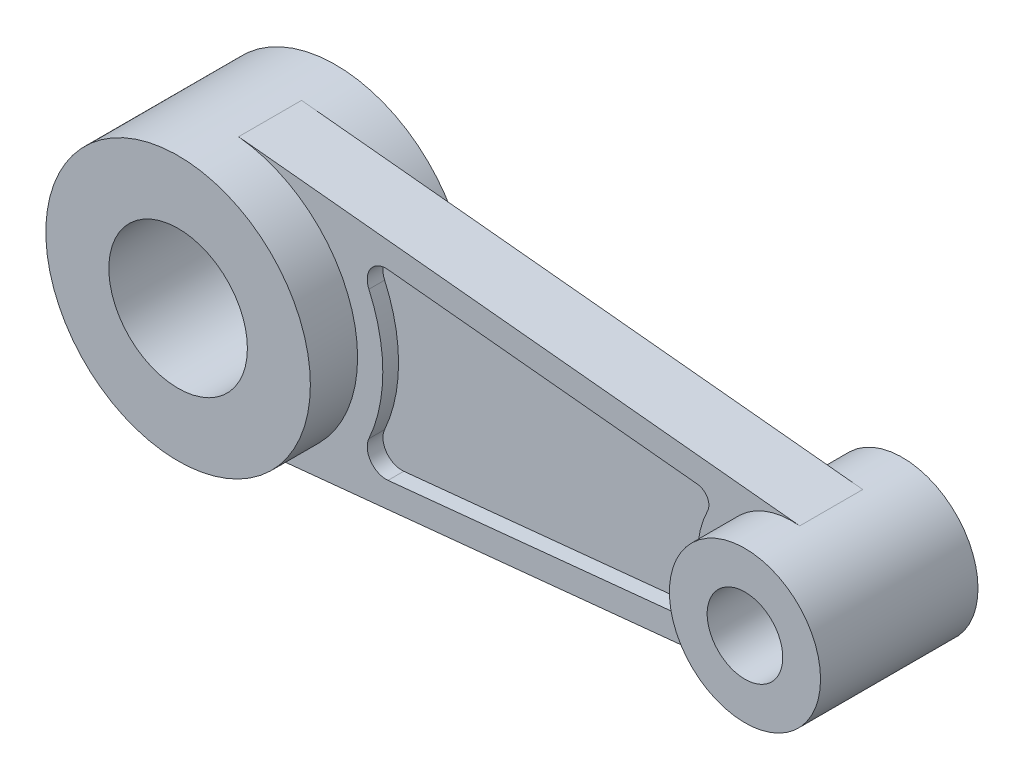
ISO-10303-21;
HEADER;
FILE_DESCRIPTION(('STEP AP214'),'2;1');
FILE_NAME('part.step','',(''),(''),'','','');
FILE_SCHEMA(('AUTOMOTIVE_DESIGN { 1 0 10303 214 1 1 1 1 }'));
ENDSEC;
DATA;
#1=APPLICATION_CONTEXT('core data for automotive mechanical design processes');
#2=APPLICATION_PROTOCOL_DEFINITION('international standard','automotive_design',2000,#1);
#3=PRODUCT_CONTEXT('',#1,'mechanical');
#4=PRODUCT('Part','Part','',(#3));
#5=PRODUCT_RELATED_PRODUCT_CATEGORY('part','',(#4));
#6=PRODUCT_DEFINITION_FORMATION('','',#4);
#7=PRODUCT_DEFINITION_CONTEXT('part definition',#1,'design');
#8=PRODUCT_DEFINITION('design','',#6,#7);
#9=PRODUCT_DEFINITION_SHAPE('','',#8);
#10=(LENGTH_UNIT() NAMED_UNIT(*) SI_UNIT(.MILLI.,.METRE.));
#11=(NAMED_UNIT(*) PLANE_ANGLE_UNIT() SI_UNIT($,.RADIAN.));
#12=(NAMED_UNIT(*) SI_UNIT($,.STERADIAN.) SOLID_ANGLE_UNIT());
#13=UNCERTAINTY_MEASURE_WITH_UNIT(LENGTH_MEASURE(1.E-05),#10,'distance_accuracy_value','');
#14=(GEOMETRIC_REPRESENTATION_CONTEXT(3) GLOBAL_UNCERTAINTY_ASSIGNED_CONTEXT((#13)) GLOBAL_UNIT_ASSIGNED_CONTEXT((#10,
#11,#12)) REPRESENTATION_CONTEXT('',''));
#15=CARTESIAN_POINT('',(0.,0.,0.));
#16=DIRECTION('',(0.,0.,1.));
#17=DIRECTION('',(1.,0.,0.));
#18=AXIS2_PLACEMENT_3D('',#15,#16,#17);
#19=CARTESIAN_POINT('',(0.,0.,-127.));
#20=DIRECTION('',(0.,0.,1.));
#21=DIRECTION('',(1.,0.,0.));
#22=AXIS2_PLACEMENT_3D('',#19,#20,#21);
#23=PLANE('',#22);
#24=CARTESIAN_POINT('',(0.,0.,-127.));
#25=DIRECTION('',(0.,0.,-1.));
#26=DIRECTION('',(1.,0.,0.));
#27=AXIS2_PLACEMENT_3D('',#24,#25,#26);
#28=CIRCLE('',#27,533.4);
#29=CARTESIAN_POINT('',(53.34,530.726298952671,-127.));
#30=VERTEX_POINT('',#29);
#31=CARTESIAN_POINT('',(53.34,-530.726298952671,-127.));
#32=VERTEX_POINT('',#31);
#33=EDGE_CURVE('E389',#30,#32,#28,.T.);
#34=ORIENTED_EDGE('',*,*,#33,.F.);
#35=DIRECTION('',(-0.99498743710662,0.1,0.));
#36=VECTOR('',#35,1.);
#37=CARTESIAN_POINT('',(53.34,530.726298952671,-127.));
#38=LINE('',#37,#36);
#39=CARTESIAN_POINT('',(2316.48,303.272170830098,-127.));
#40=VERTEX_POINT('',#39);
#41=EDGE_CURVE('E398',#40,#30,#38,.T.);
#42=ORIENTED_EDGE('',*,*,#41,.F.);
#43=CARTESIAN_POINT('',(2286.,0.,-127.));
#44=DIRECTION('',(0.,0.,-1.));
#45=DIRECTION('',(1.,0.,0.));
#46=AXIS2_PLACEMENT_3D('',#43,#44,#45);
#47=CIRCLE('',#46,304.8);
#48=CARTESIAN_POINT('',(2316.48,-303.272170830098,-127.));
#49=VERTEX_POINT('',#48);
#50=EDGE_CURVE('E414',#49,#40,#47,.T.);
#51=ORIENTED_EDGE('',*,*,#50,.F.);
#52=DIRECTION('',(0.99498743710662,0.1,0.));
#53=VECTOR('',#52,1.);
#54=CARTESIAN_POINT('',(53.34,-530.726298952671,-127.));
#55=LINE('',#54,#53);
#56=EDGE_CURVE('E411',#32,#49,#55,.T.);
#57=ORIENTED_EDGE('',*,*,#56,.F.);
#58=EDGE_LOOP('',(#34,#42,#51,#57));
#59=FACE_BOUND('',#58,.T.);
#60=CARTESIAN_POINT('',(2286.,0.,-127.));
#61=DIRECTION('',(0.,0.,1.));
#62=DIRECTION('',(-1.,0.,0.));
#63=AXIS2_PLACEMENT_3D('',#60,#61,#62);
#64=CIRCLE('',#63,381.);
#65=CARTESIAN_POINT('',(1944.75300151405,169.444639998829,-127.));
#66=VERTEX_POINT('',#65);
#67=CARTESIAN_POINT('',(1944.75300151405,-169.444639998829,-127.));
#68=VERTEX_POINT('',#67);
#69=EDGE_CURVE('E232',#66,#68,#64,.T.);
#70=ORIENTED_EDGE('',*,*,#69,.F.);
#71=CARTESIAN_POINT('',(1899.25340171593,192.037258665339,-127.));
#72=DIRECTION('',(0.,0.,-1.));
#73=DIRECTION('',(-1.,0.,0.));
#74=AXIS2_PLACEMENT_3D('',#71,#72,#73);
#75=CIRCLE('',#74,50.8);
#76=CARTESIAN_POINT('',(1904.33340171593,242.582620470356,-127.));
#77=VERTEX_POINT('',#76);
#78=EDGE_CURVE('E59',#77,#66,#75,.T.);
#79=ORIENTED_EDGE('',*,*,#78,.F.);
#80=DIRECTION('',(0.99498743710662,-0.1,0.));
#81=VECTOR('',#80,1.);
#82=CARTESIAN_POINT('',(1904.33340171593,242.582620470356,-127.));
#83=LINE('',#82,#81);
#84=CARTESIAN_POINT('',(656.009943132677,368.043848625489,-127.));
#85=VERTEX_POINT('',#84);
#86=EDGE_CURVE('E204',#85,#77,#83,.T.);
#87=ORIENTED_EDGE('',*,*,#86,.F.);
#88=CARTESIAN_POINT('',(648.389943132677,292.225805917965,-127.));
#89=DIRECTION('',(0.,0.,-1.));
#90=DIRECTION('',(-1.,0.,0.));
#91=AXIS2_PLACEMENT_3D('',#88,#89,#90);
#92=CIRCLE('',#91,76.2000000000001);
#93=CARTESIAN_POINT('',(578.919592082747,260.91589814104,-127.));
#94=VERTEX_POINT('',#93);
#95=EDGE_CURVE('E208',#94,#85,#92,.T.);
#96=ORIENTED_EDGE('',*,*,#95,.F.);
#97=CARTESIAN_POINT('',(0.,0.,-127.));
#98=DIRECTION('',(0.,0.,1.));
#99=DIRECTION('',(-1.,0.,0.));
#100=AXIS2_PLACEMENT_3D('',#97,#98,#99);
#101=CIRCLE('',#100,635.);
#102=CARTESIAN_POINT('',(578.919592082747,-260.91589814104,-127.));
#103=VERTEX_POINT('',#102);
#104=EDGE_CURVE('E247',#103,#94,#101,.T.);
#105=ORIENTED_EDGE('',*,*,#104,.F.);
#106=CARTESIAN_POINT('',(648.389943132677,-292.225805917965,-127.));
#107=DIRECTION('',(0.,0.,-1.));
#108=DIRECTION('',(-1.,0.,0.));
#109=AXIS2_PLACEMENT_3D('',#106,#107,#108);
#110=CIRCLE('',#109,76.2000000000001);
#111=CARTESIAN_POINT('',(656.009943132677,-368.043848625489,-127.));
#112=VERTEX_POINT('',#111);
#113=EDGE_CURVE('E243',#112,#103,#110,.T.);
#114=ORIENTED_EDGE('',*,*,#113,.F.);
#115=DIRECTION('',(-0.99498743710662,-0.1,0.));
#116=VECTOR('',#115,1.);
#117=CARTESIAN_POINT('',(656.009943132677,-368.043848625489,-127.));
#118=LINE('',#117,#116);
#119=CARTESIAN_POINT('',(1904.33340171593,-242.582620470356,-127.));
#120=VERTEX_POINT('',#119);
#121=EDGE_CURVE('E239',#120,#112,#118,.T.);
#122=ORIENTED_EDGE('',*,*,#121,.F.);
#123=CARTESIAN_POINT('',(1899.25340171593,-192.037258665339,-127.));
#124=DIRECTION('',(0.,0.,-1.));
#125=DIRECTION('',(-1.,0.,0.));
#126=AXIS2_PLACEMENT_3D('',#123,#124,#125);
#127=CIRCLE('',#126,50.8);
#128=EDGE_CURVE('E235',#68,#120,#127,.T.);
#129=ORIENTED_EDGE('',*,*,#128,.F.);
#130=EDGE_LOOP('',(#70,#79,#87,#96,#105,#114,#122,#129));
#131=FACE_BOUND('',#130,.T.);
#132=ADVANCED_FACE('F43',(#59,#131),#23,.F.);
#133=CARTESIAN_POINT('',(0.,0.,127.));
#134=DIRECTION('',(0.,0.,1.));
#135=DIRECTION('',(1.,0.,0.));
#136=AXIS2_PLACEMENT_3D('',#133,#134,#135);
#137=PLANE('',#136);
#138=CARTESIAN_POINT('',(0.,0.,127.));
#139=DIRECTION('',(0.,0.,-1.));
#140=DIRECTION('',(1.,0.,0.));
#141=AXIS2_PLACEMENT_3D('',#138,#139,#140);
#142=CIRCLE('',#141,533.4);
#143=CARTESIAN_POINT('',(53.34,530.726298952671,127.));
#144=VERTEX_POINT('',#143);
#145=CARTESIAN_POINT('',(53.34,-530.726298952671,127.));
#146=VERTEX_POINT('',#145);
#147=EDGE_CURVE('E393',#144,#146,#142,.T.);
#148=ORIENTED_EDGE('',*,*,#147,.T.);
#149=DIRECTION('',(0.99498743710662,0.1,0.));
#150=VECTOR('',#149,1.);
#151=CARTESIAN_POINT('',(53.34,-530.726298952671,127.));
#152=LINE('',#151,#150);
#153=CARTESIAN_POINT('',(2316.48,-303.272170830098,127.));
#154=VERTEX_POINT('',#153);
#155=EDGE_CURVE('E397',#146,#154,#152,.T.);
#156=ORIENTED_EDGE('',*,*,#155,.T.);
#157=CARTESIAN_POINT('',(2286.,0.,127.));
#158=DIRECTION('',(0.,0.,-1.));
#159=DIRECTION('',(1.,0.,0.));
#160=AXIS2_PLACEMENT_3D('',#157,#158,#159);
#161=CIRCLE('',#160,304.8);
#162=CARTESIAN_POINT('',(2316.48,303.272170830098,127.));
#163=VERTEX_POINT('',#162);
#164=EDGE_CURVE('E401',#154,#163,#161,.T.);
#165=ORIENTED_EDGE('',*,*,#164,.T.);
#166=DIRECTION('',(-0.99498743710662,0.1,0.));
#167=VECTOR('',#166,1.);
#168=CARTESIAN_POINT('',(53.34,530.726298952671,127.));
#169=LINE('',#168,#167);
#170=EDGE_CURVE('E404',#163,#144,#169,.T.);
#171=ORIENTED_EDGE('',*,*,#170,.T.);
#172=EDGE_LOOP('',(#148,#156,#165,#171));
#173=FACE_BOUND('',#172,.T.);
#174=CARTESIAN_POINT('',(648.389943132677,292.225805917965,127.));
#175=DIRECTION('',(0.,0.,1.));
#176=DIRECTION('',(1.,0.,0.));
#177=AXIS2_PLACEMENT_3D('',#174,#175,#176);
#178=CIRCLE('',#177,76.2);
#179=CARTESIAN_POINT('',(656.009943132677,368.043848625489,127.));
#180=VERTEX_POINT('',#179);
#181=CARTESIAN_POINT('',(578.919592082747,260.91589814104,127.));
#182=VERTEX_POINT('',#181);
#183=EDGE_CURVE('E67',#180,#182,#178,.T.);
#184=ORIENTED_EDGE('',*,*,#183,.F.);
#185=DIRECTION('',(-0.99498743710662,0.1,0.));
#186=VECTOR('',#185,1.);
#187=CARTESIAN_POINT('',(1904.33340171593,242.582620470356,127.));
#188=LINE('',#187,#186);
#189=CARTESIAN_POINT('',(1904.33340171593,242.582620470356,127.));
#190=VERTEX_POINT('',#189);
#191=EDGE_CURVE('E279',#190,#180,#188,.T.);
#192=ORIENTED_EDGE('',*,*,#191,.F.);
#193=CARTESIAN_POINT('',(1899.25340171593,192.037258665339,127.));
#194=DIRECTION('',(0.,0.,1.));
#195=DIRECTION('',(1.,0.,0.));
#196=AXIS2_PLACEMENT_3D('',#193,#194,#195);
#197=CIRCLE('',#196,50.7999999999999);
#198=CARTESIAN_POINT('',(1944.75300151405,169.444639998829,127.));
#199=VERTEX_POINT('',#198);
#200=EDGE_CURVE('E330',#199,#190,#197,.T.);
#201=ORIENTED_EDGE('',*,*,#200,.F.);
#202=CARTESIAN_POINT('',(2286.,0.,127.));
#203=DIRECTION('',(0.,0.,-1.));
#204=DIRECTION('',(1.,0.,0.));
#205=AXIS2_PLACEMENT_3D('',#202,#203,#204);
#206=CIRCLE('',#205,381.);
#207=CARTESIAN_POINT('',(1944.75300151405,-169.444639998829,127.));
#208=VERTEX_POINT('',#207);
#209=EDGE_CURVE('E326',#208,#199,#206,.T.);
#210=ORIENTED_EDGE('',*,*,#209,.F.);
#211=CARTESIAN_POINT('',(1899.25340171593,-192.037258665339,127.));
#212=DIRECTION('',(0.,0.,1.));
#213=DIRECTION('',(1.,0.,0.));
#214=AXIS2_PLACEMENT_3D('',#211,#212,#213);
#215=CIRCLE('',#214,50.7999999999999);
#216=CARTESIAN_POINT('',(1904.33340171593,-242.582620470356,127.));
#217=VERTEX_POINT('',#216);
#218=EDGE_CURVE('E322',#217,#208,#215,.T.);
#219=ORIENTED_EDGE('',*,*,#218,.F.);
#220=DIRECTION('',(0.99498743710662,0.1,0.));
#221=VECTOR('',#220,1.);
#222=CARTESIAN_POINT('',(656.009943132677,-368.043848625489,127.));
#223=LINE('',#222,#221);
#224=CARTESIAN_POINT('',(656.009943132677,-368.043848625489,127.));
#225=VERTEX_POINT('',#224);
#226=EDGE_CURVE('E318',#225,#217,#223,.T.);
#227=ORIENTED_EDGE('',*,*,#226,.F.);
#228=CARTESIAN_POINT('',(648.389943132677,-292.225805917965,127.));
#229=DIRECTION('',(0.,0.,1.));
#230=DIRECTION('',(1.,0.,0.));
#231=AXIS2_PLACEMENT_3D('',#228,#229,#230);
#232=CIRCLE('',#231,76.2);
#233=CARTESIAN_POINT('',(578.919592082747,-260.91589814104,127.));
#234=VERTEX_POINT('',#233);
#235=EDGE_CURVE('E314',#234,#225,#232,.T.);
#236=ORIENTED_EDGE('',*,*,#235,.F.);
#237=CARTESIAN_POINT('',(0.,0.,127.));
#238=DIRECTION('',(0.,0.,-1.));
#239=DIRECTION('',(1.,0.,0.));
#240=AXIS2_PLACEMENT_3D('',#237,#238,#239);
#241=CIRCLE('',#240,635.);
#242=EDGE_CURVE('E310',#182,#234,#241,.T.);
#243=ORIENTED_EDGE('',*,*,#242,.F.);
#244=EDGE_LOOP('',(#184,#192,#201,#210,#219,#227,#236,#243));
#245=FACE_BOUND('',#244,.T.);
#246=ADVANCED_FACE('F447',(#173,#245),#137,.T.);
#247=CARTESIAN_POINT('',(53.34,-530.726298952671,127.));
#248=DIRECTION('',(-0.1,0.99498743710662,0.));
#249=DIRECTION('',(-0.99498743710662,-0.1,0.));
#250=AXIS2_PLACEMENT_3D('',#247,#248,#249);
#251=PLANE('',#250);
#252=ORIENTED_EDGE('',*,*,#56,.T.);
#253=DIRECTION('',(0.,0.,-1.));
#254=VECTOR('',#253,1.);
#255=CARTESIAN_POINT('',(2316.48,-303.272170830098,127.));
#256=LINE('',#255,#254);
#257=EDGE_CURVE('E52',#154,#49,#256,.T.);
#258=ORIENTED_EDGE('',*,*,#257,.F.);
#259=ORIENTED_EDGE('',*,*,#155,.F.);
#260=DIRECTION('',(0.,0.,-1.));
#261=VECTOR('',#260,1.);
#262=CARTESIAN_POINT('',(53.34,-530.726298952671,127.));
#263=LINE('',#262,#261);
#264=EDGE_CURVE('E11',#146,#32,#263,.T.);
#265=ORIENTED_EDGE('',*,*,#264,.T.);
#266=EDGE_LOOP('',(#252,#258,#259,#265));
#267=FACE_BOUND('',#266,.T.);
#268=ADVANCED_FACE('F45',(#267),#251,.F.);
#269=CARTESIAN_POINT('',(53.34,530.726298952671,127.));
#270=DIRECTION('',(-0.1,-0.99498743710662,0.));
#271=DIRECTION('',(0.99498743710662,-0.1,0.));
#272=AXIS2_PLACEMENT_3D('',#269,#270,#271);
#273=PLANE('',#272);
#274=ORIENTED_EDGE('',*,*,#41,.T.);
#275=DIRECTION('',(0.,0.,-1.));
#276=VECTOR('',#275,1.);
#277=CARTESIAN_POINT('',(53.34,530.726298952671,127.));
#278=LINE('',#277,#276);
#279=EDGE_CURVE('E407',#144,#30,#278,.T.);
#280=ORIENTED_EDGE('',*,*,#279,.F.);
#281=ORIENTED_EDGE('',*,*,#170,.F.);
#282=DIRECTION('',(0.,0.,-1.));
#283=VECTOR('',#282,1.);
#284=CARTESIAN_POINT('',(2316.48,303.272170830098,127.));
#285=LINE('',#284,#283);
#286=EDGE_CURVE('E423',#163,#40,#285,.T.);
#287=ORIENTED_EDGE('',*,*,#286,.T.);
#288=EDGE_LOOP('',(#274,#280,#281,#287));
#289=FACE_BOUND('',#288,.T.);
#290=ADVANCED_FACE('F444',(#289),#273,.F.);
#291=CARTESIAN_POINT('',(0.,0.,317.5));
#292=DIRECTION('',(0.,0.,-1.));
#293=DIRECTION('',(-1.,0.,0.));
#294=AXIS2_PLACEMENT_3D('',#291,#292,#293);
#295=CYLINDRICAL_SURFACE('',#294,533.4);
#296=ORIENTED_EDGE('',*,*,#147,.F.);
#297=ORIENTED_EDGE('',*,*,#279,.T.);
#298=ORIENTED_EDGE('',*,*,#33,.T.);
#299=ORIENTED_EDGE('',*,*,#264,.F.);
#300=EDGE_LOOP('',(#296,#297,#298,#299));
#301=FACE_BOUND('',#300,.T.);
#302=CARTESIAN_POINT('',(0.,0.,317.5));
#303=DIRECTION('',(0.,0.,1.));
#304=DIRECTION('',(1.,0.,0.));
#305=AXIS2_PLACEMENT_3D('',#302,#303,#304);
#306=CIRCLE('',#305,533.4);
#307=CARTESIAN_POINT('',(533.4,0.,317.5));
#308=VERTEX_POINT('',#307);
#309=EDGE_CURVE('E385',#308,#308,#306,.T.);
#310=ORIENTED_EDGE('',*,*,#309,.F.);
#311=EDGE_LOOP('',(#310));
#312=FACE_BOUND('',#311,.T.);
#313=CARTESIAN_POINT('',(0.,0.,-317.5));
#314=DIRECTION('',(0.,0.,1.));
#315=DIRECTION('',(1.,0.,0.));
#316=AXIS2_PLACEMENT_3D('',#313,#314,#315);
#317=CIRCLE('',#316,533.4);
#318=CARTESIAN_POINT('',(533.4,0.,-317.5));
#319=VERTEX_POINT('',#318);
#320=EDGE_CURVE('E381',#319,#319,#317,.T.);
#321=ORIENTED_EDGE('',*,*,#320,.T.);
#322=EDGE_LOOP('',(#321));
#323=FACE_BOUND('',#322,.T.);
#324=ADVANCED_FACE('F450',(#301,#312,#323),#295,.T.);
#325=CARTESIAN_POINT('',(0.,0.,317.5));
#326=DIRECTION('',(0.,0.,1.));
#327=DIRECTION('',(1.,0.,0.));
#328=AXIS2_PLACEMENT_3D('',#325,#326,#327);
#329=PLANE('',#328);
#330=CARTESIAN_POINT('',(0.,0.,317.5));
#331=DIRECTION('',(0.,0.,1.));
#332=DIRECTION('',(1.,0.,0.));
#333=AXIS2_PLACEMENT_3D('',#330,#331,#332);
#334=CIRCLE('',#333,279.4);
#335=CARTESIAN_POINT('',(279.4,0.,317.5));
#336=VERTEX_POINT('',#335);
#337=EDGE_CURVE('E361',#336,#336,#334,.T.);
#338=ORIENTED_EDGE('',*,*,#337,.F.);
#339=EDGE_LOOP('',(#338));
#340=FACE_BOUND('',#339,.T.);
#341=ORIENTED_EDGE('',*,*,#309,.T.);
#342=EDGE_LOOP('',(#341));
#343=FACE_BOUND('',#342,.T.);
#344=ADVANCED_FACE('F453',(#340,#343),#329,.T.);
#345=CARTESIAN_POINT('',(0.,0.,-317.5));
#346=DIRECTION('',(0.,0.,1.));
#347=DIRECTION('',(1.,0.,0.));
#348=AXIS2_PLACEMENT_3D('',#345,#346,#347);
#349=PLANE('',#348);
#350=CARTESIAN_POINT('',(0.,0.,-317.5));
#351=DIRECTION('',(0.,0.,1.));
#352=DIRECTION('',(1.,0.,0.));
#353=AXIS2_PLACEMENT_3D('',#350,#351,#352);
#354=CIRCLE('',#353,279.4);
#355=CARTESIAN_POINT('',(279.4,0.,-317.5));
#356=VERTEX_POINT('',#355);
#357=EDGE_CURVE('E365',#356,#356,#354,.T.);
#358=ORIENTED_EDGE('',*,*,#357,.T.);
#359=EDGE_LOOP('',(#358));
#360=FACE_BOUND('',#359,.T.);
#361=ORIENTED_EDGE('',*,*,#320,.F.);
#362=EDGE_LOOP('',(#361));
#363=FACE_BOUND('',#362,.T.);
#364=ADVANCED_FACE('F459',(#360,#363),#349,.F.);
#365=CARTESIAN_POINT('',(2286.,0.,317.5));
#366=DIRECTION('',(0.,0.,-1.));
#367=DIRECTION('',(-1.,0.,0.));
#368=AXIS2_PLACEMENT_3D('',#365,#366,#367);
#369=CYLINDRICAL_SURFACE('',#368,304.8);
#370=ORIENTED_EDGE('',*,*,#164,.F.);
#371=ORIENTED_EDGE('',*,*,#257,.T.);
#372=ORIENTED_EDGE('',*,*,#50,.T.);
#373=ORIENTED_EDGE('',*,*,#286,.F.);
#374=EDGE_LOOP('',(#370,#371,#372,#373));
#375=FACE_BOUND('',#374,.T.);
#376=CARTESIAN_POINT('',(2286.,0.,317.5));
#377=DIRECTION('',(0.,0.,1.));
#378=DIRECTION('',(1.,0.,0.));
#379=AXIS2_PLACEMENT_3D('',#376,#377,#378);
#380=CIRCLE('',#379,304.8);
#381=CARTESIAN_POINT('',(2590.8,0.,317.5));
#382=VERTEX_POINT('',#381);
#383=EDGE_CURVE('E370',#382,#382,#380,.T.);
#384=ORIENTED_EDGE('',*,*,#383,.F.);
#385=EDGE_LOOP('',(#384));
#386=FACE_BOUND('',#385,.T.);
#387=CARTESIAN_POINT('',(2286.,0.,-317.5));
#388=DIRECTION('',(0.,0.,1.));
#389=DIRECTION('',(1.,0.,0.));
#390=AXIS2_PLACEMENT_3D('',#387,#388,#389);
#391=CIRCLE('',#390,304.8);
#392=CARTESIAN_POINT('',(2590.8,0.,-317.5));
#393=VERTEX_POINT('',#392);
#394=EDGE_CURVE('E377',#393,#393,#391,.T.);
#395=ORIENTED_EDGE('',*,*,#394,.T.);
#396=EDGE_LOOP('',(#395));
#397=FACE_BOUND('',#396,.T.);
#398=ADVANCED_FACE('F431',(#375,#386,#397),#369,.T.);
#399=CARTESIAN_POINT('',(2286.,0.,317.5));
#400=DIRECTION('',(0.,0.,1.));
#401=DIRECTION('',(1.,0.,0.));
#402=AXIS2_PLACEMENT_3D('',#399,#400,#401);
#403=PLANE('',#402);
#404=CARTESIAN_POINT('',(2286.,0.,317.5));
#405=DIRECTION('',(0.,0.,1.));
#406=DIRECTION('',(1.,0.,0.));
#407=AXIS2_PLACEMENT_3D('',#404,#405,#406);
#408=CIRCLE('',#407,152.4);
#409=CARTESIAN_POINT('',(2438.4,0.,317.5));
#410=VERTEX_POINT('',#409);
#411=EDGE_CURVE('E366',#410,#410,#408,.T.);
#412=ORIENTED_EDGE('',*,*,#411,.F.);
#413=EDGE_LOOP('',(#412));
#414=FACE_BOUND('',#413,.T.);
#415=ORIENTED_EDGE('',*,*,#383,.T.);
#416=EDGE_LOOP('',(#415));
#417=FACE_BOUND('',#416,.T.);
#418=ADVANCED_FACE('F467',(#414,#417),#403,.T.);
#419=CARTESIAN_POINT('',(2286.,0.,-317.5));
#420=DIRECTION('',(0.,0.,1.));
#421=DIRECTION('',(1.,0.,0.));
#422=AXIS2_PLACEMENT_3D('',#419,#420,#421);
#423=PLANE('',#422);
#424=CARTESIAN_POINT('',(2286.,0.,-317.5));
#425=DIRECTION('',(0.,0.,1.));
#426=DIRECTION('',(1.,0.,0.));
#427=AXIS2_PLACEMENT_3D('',#424,#425,#426);
#428=CIRCLE('',#427,152.4);
#429=CARTESIAN_POINT('',(2438.4,0.,-317.5));
#430=VERTEX_POINT('',#429);
#431=EDGE_CURVE('E340',#430,#430,#428,.T.);
#432=ORIENTED_EDGE('',*,*,#431,.T.);
#433=EDGE_LOOP('',(#432));
#434=FACE_BOUND('',#433,.T.);
#435=ORIENTED_EDGE('',*,*,#394,.F.);
#436=EDGE_LOOP('',(#435));
#437=FACE_BOUND('',#436,.T.);
#438=ADVANCED_FACE('F707',(#434,#437),#423,.F.);
#439=CARTESIAN_POINT('',(2286.,0.,-317.5));
#440=DIRECTION('',(0.,0.,1.));
#441=DIRECTION('',(1.,0.,0.));
#442=AXIS2_PLACEMENT_3D('',#439,#440,#441);
#443=CYLINDRICAL_SURFACE('',#442,152.4);
#444=CARTESIAN_POINT('',(2438.4,0.,-317.5));
#445=CARTESIAN_POINT('',(2438.4,0.,-310.885416666667));
#446=CARTESIAN_POINT('',(2438.4,0.,-304.270833333333));
#447=CARTESIAN_POINT('',(2438.4,0.,-291.041666666667));
#448=CARTESIAN_POINT('',(2438.4,0.,-284.427083333333));
#449=CARTESIAN_POINT('',(2438.4,0.,-271.197916666667));
#450=CARTESIAN_POINT('',(2438.4,0.,-264.583333333333));
#451=CARTESIAN_POINT('',(2438.4,0.,-251.354166666667));
#452=CARTESIAN_POINT('',(2438.4,0.,-244.739583333333));
#453=CARTESIAN_POINT('',(2438.4,0.,-231.510416666667));
#454=CARTESIAN_POINT('',(2438.4,0.,-224.895833333333));
#455=CARTESIAN_POINT('',(2438.4,0.,-211.666666666667));
#456=CARTESIAN_POINT('',(2438.4,0.,-205.052083333333));
#457=CARTESIAN_POINT('',(2438.4,0.,-191.822916666667));
#458=CARTESIAN_POINT('',(2438.4,0.,-185.208333333333));
#459=CARTESIAN_POINT('',(2438.4,0.,-171.979166666667));
#460=CARTESIAN_POINT('',(2438.4,0.,-165.364583333333));
#461=CARTESIAN_POINT('',(2438.4,0.,-152.135416666667));
#462=CARTESIAN_POINT('',(2438.4,0.,-145.520833333333));
#463=CARTESIAN_POINT('',(2438.4,0.,-132.291666666667));
#464=CARTESIAN_POINT('',(2438.4,0.,-125.677083333333));
#465=CARTESIAN_POINT('',(2438.4,0.,-112.447916666667));
#466=CARTESIAN_POINT('',(2438.4,0.,-105.833333333333));
#467=CARTESIAN_POINT('',(2438.4,0.,-92.6041666666667));
#468=CARTESIAN_POINT('',(2438.4,0.,-85.9895833333334));
#469=CARTESIAN_POINT('',(2438.4,0.,-72.7604166666667));
#470=CARTESIAN_POINT('',(2438.4,0.,-66.1458333333334));
#471=CARTESIAN_POINT('',(2438.4,0.,-52.9166666666667));
#472=CARTESIAN_POINT('',(2438.4,0.,-46.3020833333334));
#473=CARTESIAN_POINT('',(2438.4,0.,-33.0729166666667));
#474=CARTESIAN_POINT('',(2438.4,0.,-26.4583333333334));
#475=CARTESIAN_POINT('',(2438.4,0.,-13.2291666666667));
#476=CARTESIAN_POINT('',(2438.4,0.,-6.61458333333339));
#477=CARTESIAN_POINT('',(2438.4,0.,6.61458333333328));
#478=CARTESIAN_POINT('',(2438.4,0.,13.2291666666666));
#479=CARTESIAN_POINT('',(2438.4,0.,26.4583333333333));
#480=CARTESIAN_POINT('',(2438.4,0.,33.0729166666666));
#481=CARTESIAN_POINT('',(2438.4,0.,46.3020833333333));
#482=CARTESIAN_POINT('',(2438.4,0.,52.9166666666666));
#483=CARTESIAN_POINT('',(2438.4,0.,66.1458333333333));
#484=CARTESIAN_POINT('',(2438.4,0.,72.7604166666666));
#485=CARTESIAN_POINT('',(2438.4,0.,85.9895833333333));
#486=CARTESIAN_POINT('',(2438.4,0.,92.6041666666666));
#487=CARTESIAN_POINT('',(2438.4,0.,105.833333333333));
#488=CARTESIAN_POINT('',(2438.4,0.,112.447916666667));
#489=CARTESIAN_POINT('',(2438.4,0.,125.677083333333));
#490=CARTESIAN_POINT('',(2438.4,0.,132.291666666667));
#491=CARTESIAN_POINT('',(2438.4,0.,145.520833333333));
#492=CARTESIAN_POINT('',(2438.4,0.,152.135416666667));
#493=CARTESIAN_POINT('',(2438.4,0.,165.364583333333));
#494=CARTESIAN_POINT('',(2438.4,0.,171.979166666667));
#495=CARTESIAN_POINT('',(2438.4,0.,185.208333333333));
#496=CARTESIAN_POINT('',(2438.4,0.,191.822916666667));
#497=CARTESIAN_POINT('',(2438.4,0.,205.052083333333));
#498=CARTESIAN_POINT('',(2438.4,0.,211.666666666667));
#499=CARTESIAN_POINT('',(2438.4,0.,224.895833333333));
#500=CARTESIAN_POINT('',(2438.4,0.,231.510416666667));
#501=CARTESIAN_POINT('',(2438.4,0.,244.739583333333));
#502=CARTESIAN_POINT('',(2438.4,0.,251.354166666667));
#503=CARTESIAN_POINT('',(2438.4,0.,264.583333333333));
#504=CARTESIAN_POINT('',(2438.4,0.,271.197916666667));
#505=CARTESIAN_POINT('',(2438.4,0.,284.427083333333));
#506=CARTESIAN_POINT('',(2438.4,0.,291.041666666667));
#507=CARTESIAN_POINT('',(2438.4,0.,304.270833333333));
#508=CARTESIAN_POINT('',(2438.4,0.,310.885416666667));
#509=CARTESIAN_POINT('',(2438.4,0.,317.5));
#510=B_SPLINE_CURVE_WITH_KNOTS('',3,(#444,#445,#446,#447,#448,#449,#450,#451,#452,#453,#454,
#455,#456,#457,#458,#459,#460,#461,#462,#463,#464,#465,#466,#467,#468,#469,#470,#471,#472,#473,
#474,#475,#476,#477,#478,#479,#480,#481,#482,#483,#484,#485,#486,#487,#488,#489,#490,#491,#492,
#493,#494,#495,#496,#497,#498,#499,#500,#501,#502,#503,#504,#505,#506,#507,#508,#509),
.UNSPECIFIED.,.F.,.F.,(4,2,2,2,2,2,2,2,2,2,2,2,2,2,2,2,2,2,2,2,2,2,2,2,2,2,2,2,2,2,2,2,4),(0.,
19.84375,39.6875,59.53125,79.375,99.21875,119.0625,138.90625,158.75,178.59375,198.4375,
218.28125,238.125,257.96875,277.8125,297.65625,317.5,337.34375,357.1875,377.03125,396.875,
416.71875,436.5625,456.40625,476.25,496.09375,515.9375,535.78125,555.625,575.46875,595.3125,
615.15625,635.),.UNSPECIFIED.);
#511=EDGE_CURVE('BSEAM704',#430,#410,#510,.T.);
#512=ORIENTED_EDGE('',*,*,#431,.F.);
#513=ORIENTED_EDGE('',*,*,#411,.T.);
#514=ORIENTED_EDGE('',*,*,#511,.T.);
#515=ORIENTED_EDGE('',*,*,#511,.F.);
#516=EDGE_LOOP('',(#512,#514,#513,#515));
#517=FACE_BOUND('',#516,.T.);
#518=ADVANCED_FACE('F704',(#517),#443,.F.);
#519=CARTESIAN_POINT('',(0.,0.,-317.5));
#520=DIRECTION('',(0.,0.,1.));
#521=DIRECTION('',(1.,0.,0.));
#522=AXIS2_PLACEMENT_3D('',#519,#520,#521);
#523=CYLINDRICAL_SURFACE('',#522,279.4);
#524=CARTESIAN_POINT('',(279.4,0.,-317.5));
#525=CARTESIAN_POINT('',(279.4,0.,-310.885416666667));
#526=CARTESIAN_POINT('',(279.4,0.,-304.270833333333));
#527=CARTESIAN_POINT('',(279.4,0.,-291.041666666667));
#528=CARTESIAN_POINT('',(279.4,0.,-284.427083333333));
#529=CARTESIAN_POINT('',(279.4,0.,-271.197916666667));
#530=CARTESIAN_POINT('',(279.4,0.,-264.583333333333));
#531=CARTESIAN_POINT('',(279.4,0.,-251.354166666667));
#532=CARTESIAN_POINT('',(279.4,0.,-244.739583333333));
#533=CARTESIAN_POINT('',(279.4,0.,-231.510416666667));
#534=CARTESIAN_POINT('',(279.4,0.,-224.895833333333));
#535=CARTESIAN_POINT('',(279.4,0.,-211.666666666667));
#536=CARTESIAN_POINT('',(279.4,0.,-205.052083333333));
#537=CARTESIAN_POINT('',(279.4,0.,-191.822916666667));
#538=CARTESIAN_POINT('',(279.4,0.,-185.208333333333));
#539=CARTESIAN_POINT('',(279.4,0.,-171.979166666667));
#540=CARTESIAN_POINT('',(279.4,0.,-165.364583333333));
#541=CARTESIAN_POINT('',(279.4,0.,-152.135416666667));
#542=CARTESIAN_POINT('',(279.4,0.,-145.520833333333));
#543=CARTESIAN_POINT('',(279.4,0.,-132.291666666667));
#544=CARTESIAN_POINT('',(279.4,0.,-125.677083333333));
#545=CARTESIAN_POINT('',(279.4,0.,-112.447916666667));
#546=CARTESIAN_POINT('',(279.4,0.,-105.833333333333));
#547=CARTESIAN_POINT('',(279.4,0.,-92.6041666666667));
#548=CARTESIAN_POINT('',(279.4,0.,-85.9895833333334));
#549=CARTESIAN_POINT('',(279.4,0.,-72.7604166666667));
#550=CARTESIAN_POINT('',(279.4,0.,-66.1458333333334));
#551=CARTESIAN_POINT('',(279.4,0.,-52.9166666666667));
#552=CARTESIAN_POINT('',(279.4,0.,-46.3020833333334));
#553=CARTESIAN_POINT('',(279.4,0.,-33.0729166666667));
#554=CARTESIAN_POINT('',(279.4,0.,-26.4583333333334));
#555=CARTESIAN_POINT('',(279.4,0.,-13.2291666666667));
#556=CARTESIAN_POINT('',(279.4,0.,-6.61458333333339));
#557=CARTESIAN_POINT('',(279.4,0.,6.61458333333328));
#558=CARTESIAN_POINT('',(279.4,0.,13.2291666666666));
#559=CARTESIAN_POINT('',(279.4,0.,26.4583333333333));
#560=CARTESIAN_POINT('',(279.4,0.,33.0729166666666));
#561=CARTESIAN_POINT('',(279.4,0.,46.3020833333333));
#562=CARTESIAN_POINT('',(279.4,0.,52.9166666666666));
#563=CARTESIAN_POINT('',(279.4,0.,66.1458333333333));
#564=CARTESIAN_POINT('',(279.4,0.,72.7604166666666));
#565=CARTESIAN_POINT('',(279.4,0.,85.9895833333333));
#566=CARTESIAN_POINT('',(279.4,0.,92.6041666666666));
#567=CARTESIAN_POINT('',(279.4,0.,105.833333333333));
#568=CARTESIAN_POINT('',(279.4,0.,112.447916666667));
#569=CARTESIAN_POINT('',(279.4,0.,125.677083333333));
#570=CARTESIAN_POINT('',(279.4,0.,132.291666666667));
#571=CARTESIAN_POINT('',(279.4,0.,145.520833333333));
#572=CARTESIAN_POINT('',(279.4,0.,152.135416666667));
#573=CARTESIAN_POINT('',(279.4,0.,165.364583333333));
#574=CARTESIAN_POINT('',(279.4,0.,171.979166666667));
#575=CARTESIAN_POINT('',(279.4,0.,185.208333333333));
#576=CARTESIAN_POINT('',(279.4,0.,191.822916666667));
#577=CARTESIAN_POINT('',(279.4,0.,205.052083333333));
#578=CARTESIAN_POINT('',(279.4,0.,211.666666666667));
#579=CARTESIAN_POINT('',(279.4,0.,224.895833333333));
#580=CARTESIAN_POINT('',(279.4,0.,231.510416666667));
#581=CARTESIAN_POINT('',(279.4,0.,244.739583333333));
#582=CARTESIAN_POINT('',(279.4,0.,251.354166666667));
#583=CARTESIAN_POINT('',(279.4,0.,264.583333333333));
#584=CARTESIAN_POINT('',(279.4,0.,271.197916666667));
#585=CARTESIAN_POINT('',(279.4,0.,284.427083333333));
#586=CARTESIAN_POINT('',(279.4,0.,291.041666666667));
#587=CARTESIAN_POINT('',(279.4,0.,304.270833333333));
#588=CARTESIAN_POINT('',(279.4,0.,310.885416666667));
#589=CARTESIAN_POINT('',(279.4,0.,317.5));
#590=B_SPLINE_CURVE_WITH_KNOTS('',3,(#524,#525,#526,#527,#528,#529,#530,#531,#532,#533,#534,
#535,#536,#537,#538,#539,#540,#541,#542,#543,#544,#545,#546,#547,#548,#549,#550,#551,#552,#553,
#554,#555,#556,#557,#558,#559,#560,#561,#562,#563,#564,#565,#566,#567,#568,#569,#570,#571,#572,
#573,#574,#575,#576,#577,#578,#579,#580,#581,#582,#583,#584,#585,#586,#587,#588,#589),
.UNSPECIFIED.,.F.,.F.,(4,2,2,2,2,2,2,2,2,2,2,2,2,2,2,2,2,2,2,2,2,2,2,2,2,2,2,2,2,2,2,2,4),(0.,
19.84375,39.6875,59.53125,79.375,99.21875,119.0625,138.90625,158.75,178.59375,198.4375,
218.28125,238.125,257.96875,277.8125,297.65625,317.5,337.34375,357.1875,377.03125,396.875,
416.71875,436.5625,456.40625,476.25,496.09375,515.9375,535.78125,555.625,575.46875,595.3125,
615.15625,635.),.UNSPECIFIED.);
#591=EDGE_CURVE('BSEAM495',#356,#336,#590,.T.);
#592=ORIENTED_EDGE('',*,*,#357,.F.);
#593=ORIENTED_EDGE('',*,*,#337,.T.);
#594=ORIENTED_EDGE('',*,*,#591,.T.);
#595=ORIENTED_EDGE('',*,*,#591,.F.);
#596=EDGE_LOOP('',(#592,#594,#593,#595));
#597=FACE_BOUND('',#596,.T.);
#598=ADVANCED_FACE('F495',(#597),#523,.F.);
#599=CARTESIAN_POINT('',(648.389943132677,292.225805917965,63.5));
#600=DIRECTION('',(0.,0.,1.));
#601=DIRECTION('',(1.,0.,0.));
#602=AXIS2_PLACEMENT_3D('',#599,#600,#601);
#603=CYLINDRICAL_SURFACE('',#602,76.2);
#604=ORIENTED_EDGE('',*,*,#183,.T.);
#605=DIRECTION('',(0.,0.,1.));
#606=VECTOR('',#605,1.);
#607=CARTESIAN_POINT('',(578.919592082747,260.91589814104,63.5));
#608=LINE('',#607,#606);
#609=CARTESIAN_POINT('',(578.919592082747,260.91589814104,63.5));
#610=VERTEX_POINT('',#609);
#611=EDGE_CURVE('E307',#610,#182,#608,.T.);
#612=ORIENTED_EDGE('',*,*,#611,.F.);
#613=CARTESIAN_POINT('',(648.389943132677,292.225805917965,63.5));
#614=DIRECTION('',(0.,0.,1.));
#615=DIRECTION('',(1.,0.,0.));
#616=AXIS2_PLACEMENT_3D('',#613,#614,#615);
#617=CIRCLE('',#616,76.2);
#618=CARTESIAN_POINT('',(656.009943132677,368.043848625489,63.5));
#619=VERTEX_POINT('',#618);
#620=EDGE_CURVE('E274',#619,#610,#617,.T.);
#621=ORIENTED_EDGE('',*,*,#620,.F.);
#622=DIRECTION('',(0.,0.,1.));
#623=VECTOR('',#622,1.);
#624=CARTESIAN_POINT('',(656.009943132677,368.043848625489,63.5));
#625=LINE('',#624,#623);
#626=EDGE_CURVE('E337',#619,#180,#625,.T.);
#627=ORIENTED_EDGE('',*,*,#626,.T.);
#628=EDGE_LOOP('',(#604,#612,#621,#627));
#629=FACE_BOUND('',#628,.T.);
#630=ADVANCED_FACE('F500',(#629),#603,.F.);
#631=CARTESIAN_POINT('',(1904.33340171593,242.582620470356,63.5));
#632=DIRECTION('',(0.1,0.99498743710662,0.));
#633=DIRECTION('',(-0.99498743710662,0.1,0.));
#634=AXIS2_PLACEMENT_3D('',#631,#632,#633);
#635=PLANE('',#634);
#636=ORIENTED_EDGE('',*,*,#191,.T.);
#637=ORIENTED_EDGE('',*,*,#626,.F.);
#638=DIRECTION('',(-0.99498743710662,0.1,0.));
#639=VECTOR('',#638,1.);
#640=CARTESIAN_POINT('',(1904.33340171593,242.582620470356,63.5));
#641=LINE('',#640,#639);
#642=CARTESIAN_POINT('',(1904.33340171593,242.582620470356,63.5));
#643=VERTEX_POINT('',#642);
#644=EDGE_CURVE('E303',#643,#619,#641,.T.);
#645=ORIENTED_EDGE('',*,*,#644,.F.);
#646=DIRECTION('',(0.,0.,1.));
#647=VECTOR('',#646,1.);
#648=CARTESIAN_POINT('',(1904.33340171593,242.582620470356,63.5));
#649=LINE('',#648,#647);
#650=EDGE_CURVE('E341',#643,#190,#649,.T.);
#651=ORIENTED_EDGE('',*,*,#650,.T.);
#652=EDGE_LOOP('',(#636,#637,#645,#651));
#653=FACE_BOUND('',#652,.T.);
#654=ADVANCED_FACE('F505',(#653),#635,.F.);
#655=CARTESIAN_POINT('',(1899.25340171593,192.037258665339,63.5));
#656=DIRECTION('',(0.,0.,1.));
#657=DIRECTION('',(1.,0.,0.));
#658=AXIS2_PLACEMENT_3D('',#655,#656,#657);
#659=CYLINDRICAL_SURFACE('',#658,50.7999999999999);
#660=ORIENTED_EDGE('',*,*,#200,.T.);
#661=ORIENTED_EDGE('',*,*,#650,.F.);
#662=CARTESIAN_POINT('',(1899.25340171593,192.037258665339,63.5));
#663=DIRECTION('',(0.,0.,1.));
#664=DIRECTION('',(1.,0.,0.));
#665=AXIS2_PLACEMENT_3D('',#662,#663,#664);
#666=CIRCLE('',#665,50.7999999999999);
#667=CARTESIAN_POINT('',(1944.75300151405,169.444639998829,63.5));
#668=VERTEX_POINT('',#667);
#669=EDGE_CURVE('E299',#668,#643,#666,.T.);
#670=ORIENTED_EDGE('',*,*,#669,.F.);
#671=DIRECTION('',(0.,0.,1.));
#672=VECTOR('',#671,1.);
#673=CARTESIAN_POINT('',(1944.75300151405,169.444639998829,63.5));
#674=LINE('',#673,#672);
#675=EDGE_CURVE('E344',#668,#199,#674,.T.);
#676=ORIENTED_EDGE('',*,*,#675,.T.);
#677=EDGE_LOOP('',(#660,#661,#670,#676));
#678=FACE_BOUND('',#677,.T.);
#679=ADVANCED_FACE('F514',(#678),#659,.F.);
#680=CARTESIAN_POINT('',(2286.,0.,63.5));
#681=DIRECTION('',(0.,0.,1.));
#682=DIRECTION('',(1.,0.,0.));
#683=AXIS2_PLACEMENT_3D('',#680,#681,#682);
#684=CYLINDRICAL_SURFACE('',#683,381.);
#685=ORIENTED_EDGE('',*,*,#209,.T.);
#686=ORIENTED_EDGE('',*,*,#675,.F.);
#687=CARTESIAN_POINT('',(2286.,0.,63.5));
#688=DIRECTION('',(0.,0.,-1.));
#689=DIRECTION('',(1.,0.,0.));
#690=AXIS2_PLACEMENT_3D('',#687,#688,#689);
#691=CIRCLE('',#690,381.);
#692=CARTESIAN_POINT('',(1944.75300151405,-169.444639998829,63.5));
#693=VERTEX_POINT('',#692);
#694=EDGE_CURVE('E295',#693,#668,#691,.T.);
#695=ORIENTED_EDGE('',*,*,#694,.F.);
#696=DIRECTION('',(0.,0.,1.));
#697=VECTOR('',#696,1.);
#698=CARTESIAN_POINT('',(1944.75300151405,-169.444639998829,63.5));
#699=LINE('',#698,#697);
#700=EDGE_CURVE('E347',#693,#208,#699,.T.);
#701=ORIENTED_EDGE('',*,*,#700,.T.);
#702=EDGE_LOOP('',(#685,#686,#695,#701));
#703=FACE_BOUND('',#702,.T.);
#704=ADVANCED_FACE('F525',(#703),#684,.T.);
#705=CARTESIAN_POINT('',(1899.25340171593,-192.037258665339,63.5));
#706=DIRECTION('',(0.,0.,1.));
#707=DIRECTION('',(1.,0.,0.));
#708=AXIS2_PLACEMENT_3D('',#705,#706,#707);
#709=CYLINDRICAL_SURFACE('',#708,50.7999999999999);
#710=ORIENTED_EDGE('',*,*,#218,.T.);
#711=ORIENTED_EDGE('',*,*,#700,.F.);
#712=CARTESIAN_POINT('',(1899.25340171593,-192.037258665339,63.5));
#713=DIRECTION('',(0.,0.,1.));
#714=DIRECTION('',(1.,0.,0.));
#715=AXIS2_PLACEMENT_3D('',#712,#713,#714);
#716=CIRCLE('',#715,50.7999999999999);
#717=CARTESIAN_POINT('',(1904.33340171593,-242.582620470356,63.5));
#718=VERTEX_POINT('',#717);
#719=EDGE_CURVE('E291',#718,#693,#716,.T.);
#720=ORIENTED_EDGE('',*,*,#719,.F.);
#721=DIRECTION('',(0.,0.,1.));
#722=VECTOR('',#721,1.);
#723=CARTESIAN_POINT('',(1904.33340171593,-242.582620470356,63.5));
#724=LINE('',#723,#722);
#725=EDGE_CURVE('E350',#718,#217,#724,.T.);
#726=ORIENTED_EDGE('',*,*,#725,.T.);
#727=EDGE_LOOP('',(#710,#711,#720,#726));
#728=FACE_BOUND('',#727,.T.);
#729=ADVANCED_FACE('F536',(#728),#709,.F.);
#730=CARTESIAN_POINT('',(656.009943132677,-368.043848625489,63.5));
#731=DIRECTION('',(0.1,-0.99498743710662,0.));
#732=DIRECTION('',(0.99498743710662,0.1,0.));
#733=AXIS2_PLACEMENT_3D('',#730,#731,#732);
#734=PLANE('',#733);
#735=ORIENTED_EDGE('',*,*,#226,.T.);
#736=ORIENTED_EDGE('',*,*,#725,.F.);
#737=DIRECTION('',(0.99498743710662,0.1,0.));
#738=VECTOR('',#737,1.);
#739=CARTESIAN_POINT('',(656.009943132677,-368.043848625489,63.5));
#740=LINE('',#739,#738);
#741=CARTESIAN_POINT('',(656.009943132677,-368.043848625489,63.5));
#742=VERTEX_POINT('',#741);
#743=EDGE_CURVE('E287',#742,#718,#740,.T.);
#744=ORIENTED_EDGE('',*,*,#743,.F.);
#745=DIRECTION('',(0.,0.,1.));
#746=VECTOR('',#745,1.);
#747=CARTESIAN_POINT('',(656.009943132677,-368.043848625489,63.5));
#748=LINE('',#747,#746);
#749=EDGE_CURVE('E353',#742,#225,#748,.T.);
#750=ORIENTED_EDGE('',*,*,#749,.T.);
#751=EDGE_LOOP('',(#735,#736,#744,#750));
#752=FACE_BOUND('',#751,.T.);
#753=ADVANCED_FACE('F547',(#752),#734,.F.);
#754=CARTESIAN_POINT('',(648.389943132677,-292.225805917965,63.5));
#755=DIRECTION('',(0.,0.,1.));
#756=DIRECTION('',(1.,0.,0.));
#757=AXIS2_PLACEMENT_3D('',#754,#755,#756);
#758=CYLINDRICAL_SURFACE('',#757,76.2);
#759=ORIENTED_EDGE('',*,*,#235,.T.);
#760=ORIENTED_EDGE('',*,*,#749,.F.);
#761=CARTESIAN_POINT('',(648.389943132677,-292.225805917965,63.5));
#762=DIRECTION('',(0.,0.,1.));
#763=DIRECTION('',(1.,0.,0.));
#764=AXIS2_PLACEMENT_3D('',#761,#762,#763);
#765=CIRCLE('',#764,76.2);
#766=CARTESIAN_POINT('',(578.919592082747,-260.91589814104,63.5));
#767=VERTEX_POINT('',#766);
#768=EDGE_CURVE('E283',#767,#742,#765,.T.);
#769=ORIENTED_EDGE('',*,*,#768,.F.);
#770=DIRECTION('',(0.,0.,1.));
#771=VECTOR('',#770,1.);
#772=CARTESIAN_POINT('',(578.919592082747,-260.91589814104,63.5));
#773=LINE('',#772,#771);
#774=EDGE_CURVE('E356',#767,#234,#773,.T.);
#775=ORIENTED_EDGE('',*,*,#774,.T.);
#776=EDGE_LOOP('',(#759,#760,#769,#775));
#777=FACE_BOUND('',#776,.T.);
#778=ADVANCED_FACE('F558',(#777),#758,.F.);
#779=CARTESIAN_POINT('',(0.,0.,63.5));
#780=DIRECTION('',(0.,0.,1.));
#781=DIRECTION('',(1.,0.,0.));
#782=AXIS2_PLACEMENT_3D('',#779,#780,#781);
#783=CYLINDRICAL_SURFACE('',#782,635.);
#784=ORIENTED_EDGE('',*,*,#242,.T.);
#785=ORIENTED_EDGE('',*,*,#774,.F.);
#786=CARTESIAN_POINT('',(0.,0.,63.5));
#787=DIRECTION('',(0.,0.,-1.));
#788=DIRECTION('',(1.,0.,0.));
#789=AXIS2_PLACEMENT_3D('',#786,#787,#788);
#790=CIRCLE('',#789,635.);
#791=EDGE_CURVE('E278',#610,#767,#790,.T.);
#792=ORIENTED_EDGE('',*,*,#791,.F.);
#793=ORIENTED_EDGE('',*,*,#611,.T.);
#794=EDGE_LOOP('',(#784,#785,#792,#793));
#795=FACE_BOUND('',#794,.T.);
#796=ADVANCED_FACE('F569',(#795),#783,.T.);
#797=CARTESIAN_POINT('',(648.389943132677,292.225805917965,63.5));
#798=DIRECTION('',(0.,0.,1.));
#799=DIRECTION('',(1.,0.,0.));
#800=AXIS2_PLACEMENT_3D('',#797,#798,#799);
#801=PLANE('',#800);
#802=ORIENTED_EDGE('',*,*,#620,.T.);
#803=ORIENTED_EDGE('',*,*,#791,.T.);
#804=ORIENTED_EDGE('',*,*,#768,.T.);
#805=ORIENTED_EDGE('',*,*,#743,.T.);
#806=ORIENTED_EDGE('',*,*,#719,.T.);
#807=ORIENTED_EDGE('',*,*,#694,.T.);
#808=ORIENTED_EDGE('',*,*,#669,.T.);
#809=ORIENTED_EDGE('',*,*,#644,.T.);
#810=EDGE_LOOP('',(#802,#803,#804,#805,#806,#807,#808,#809));
#811=FACE_BOUND('',#810,.T.);
#812=ADVANCED_FACE('F580',(#811),#801,.T.);
#813=CARTESIAN_POINT('',(1899.25340171593,192.037258665339,-63.5));
#814=DIRECTION('',(0.,0.,-1.));
#815=DIRECTION('',(-1.,0.,0.));
#816=AXIS2_PLACEMENT_3D('',#813,#814,#815);
#817=CYLINDRICAL_SURFACE('',#816,50.8);
#818=ORIENTED_EDGE('',*,*,#78,.T.);
#819=DIRECTION('',(0.,0.,-1.));
#820=VECTOR('',#819,1.);
#821=CARTESIAN_POINT('',(1944.75300151405,169.444639998829,-63.5));
#822=LINE('',#821,#820);
#823=CARTESIAN_POINT('',(1944.75300151405,169.444639998829,-63.5));
#824=VERTEX_POINT('',#823);
#825=EDGE_CURVE('E178',#824,#66,#822,.T.);
#826=ORIENTED_EDGE('',*,*,#825,.F.);
#827=CARTESIAN_POINT('',(1899.25340171593,192.037258665339,-63.5));
#828=DIRECTION('',(0.,0.,-1.));
#829=DIRECTION('',(-1.,0.,0.));
#830=AXIS2_PLACEMENT_3D('',#827,#828,#829);
#831=CIRCLE('',#830,50.8);
#832=CARTESIAN_POINT('',(1904.33340171593,242.582620470356,-63.5));
#833=VERTEX_POINT('',#832);
#834=EDGE_CURVE('E182',#833,#824,#831,.T.);
#835=ORIENTED_EDGE('',*,*,#834,.F.);
#836=DIRECTION('',(0.,0.,-1.));
#837=VECTOR('',#836,1.);
#838=CARTESIAN_POINT('',(1904.33340171593,242.582620470356,-63.5));
#839=LINE('',#838,#837);
#840=EDGE_CURVE('E254',#833,#77,#839,.T.);
#841=ORIENTED_EDGE('',*,*,#840,.T.);
#842=EDGE_LOOP('',(#818,#826,#835,#841));
#843=FACE_BOUND('',#842,.T.);
#844=ADVANCED_FACE('F180',(#843),#817,.F.);
#845=CARTESIAN_POINT('',(1904.33340171593,242.582620470356,-63.5));
#846=DIRECTION('',(0.1,0.99498743710662,0.));
#847=DIRECTION('',(-0.99498743710662,0.1,0.));
#848=AXIS2_PLACEMENT_3D('',#845,#846,#847);
#849=PLANE('',#848);
#850=ORIENTED_EDGE('',*,*,#86,.T.);
#851=ORIENTED_EDGE('',*,*,#840,.F.);
#852=DIRECTION('',(0.99498743710662,-0.1,0.));
#853=VECTOR('',#852,1.);
#854=CARTESIAN_POINT('',(1904.33340171593,242.582620470356,-63.5));
#855=LINE('',#854,#853);
#856=CARTESIAN_POINT('',(656.009943132677,368.043848625489,-63.5));
#857=VERTEX_POINT('',#856);
#858=EDGE_CURVE('E189',#857,#833,#855,.T.);
#859=ORIENTED_EDGE('',*,*,#858,.F.);
#860=DIRECTION('',(0.,0.,-1.));
#861=VECTOR('',#860,1.);
#862=CARTESIAN_POINT('',(656.009943132677,368.043848625489,-63.5));
#863=LINE('',#862,#861);
#864=EDGE_CURVE('E257',#857,#85,#863,.T.);
#865=ORIENTED_EDGE('',*,*,#864,.T.);
#866=EDGE_LOOP('',(#850,#851,#859,#865));
#867=FACE_BOUND('',#866,.T.);
#868=ADVANCED_FACE('F606',(#867),#849,.F.);
#869=CARTESIAN_POINT('',(648.389943132677,292.225805917965,-63.5));
#870=DIRECTION('',(0.,0.,-1.));
#871=DIRECTION('',(-1.,0.,0.));
#872=AXIS2_PLACEMENT_3D('',#869,#870,#871);
#873=CYLINDRICAL_SURFACE('',#872,76.2000000000001);
#874=ORIENTED_EDGE('',*,*,#95,.T.);
#875=ORIENTED_EDGE('',*,*,#864,.F.);
#876=CARTESIAN_POINT('',(648.389943132677,292.225805917965,-63.5));
#877=DIRECTION('',(0.,0.,-1.));
#878=DIRECTION('',(-1.,0.,0.));
#879=AXIS2_PLACEMENT_3D('',#876,#877,#878);
#880=CIRCLE('',#879,76.2000000000001);
#881=CARTESIAN_POINT('',(578.919592082747,260.91589814104,-63.5));
#882=VERTEX_POINT('',#881);
#883=EDGE_CURVE('E225',#882,#857,#880,.T.);
#884=ORIENTED_EDGE('',*,*,#883,.F.);
#885=DIRECTION('',(0.,0.,-1.));
#886=VECTOR('',#885,1.);
#887=CARTESIAN_POINT('',(578.919592082747,260.91589814104,-63.5));
#888=LINE('',#887,#886);
#889=EDGE_CURVE('E260',#882,#94,#888,.T.);
#890=ORIENTED_EDGE('',*,*,#889,.T.);
#891=EDGE_LOOP('',(#874,#875,#884,#890));
#892=FACE_BOUND('',#891,.T.);
#893=ADVANCED_FACE('F615',(#892),#873,.F.);
#894=CARTESIAN_POINT('',(0.,0.,-63.5));
#895=DIRECTION('',(0.,0.,-1.));
#896=DIRECTION('',(-1.,0.,0.));
#897=AXIS2_PLACEMENT_3D('',#894,#895,#896);
#898=CYLINDRICAL_SURFACE('',#897,635.);
#899=ORIENTED_EDGE('',*,*,#104,.T.);
#900=ORIENTED_EDGE('',*,*,#889,.F.);
#901=CARTESIAN_POINT('',(0.,0.,-63.5));
#902=DIRECTION('',(0.,0.,1.));
#903=DIRECTION('',(-1.,0.,0.));
#904=AXIS2_PLACEMENT_3D('',#901,#902,#903);
#905=CIRCLE('',#904,635.);
#906=CARTESIAN_POINT('',(578.919592082747,-260.91589814104,-63.5));
#907=VERTEX_POINT('',#906);
#908=EDGE_CURVE('E221',#907,#882,#905,.T.);
#909=ORIENTED_EDGE('',*,*,#908,.F.);
#910=DIRECTION('',(0.,0.,-1.));
#911=VECTOR('',#910,1.);
#912=CARTESIAN_POINT('',(578.919592082747,-260.91589814104,-63.5));
#913=LINE('',#912,#911);
#914=EDGE_CURVE('E263',#907,#103,#913,.T.);
#915=ORIENTED_EDGE('',*,*,#914,.T.);
#916=EDGE_LOOP('',(#899,#900,#909,#915));
#917=FACE_BOUND('',#916,.T.);
#918=ADVANCED_FACE('F626',(#917),#898,.T.);
#919=CARTESIAN_POINT('',(648.389943132677,-292.225805917965,-63.5));
#920=DIRECTION('',(0.,0.,-1.));
#921=DIRECTION('',(-1.,0.,0.));
#922=AXIS2_PLACEMENT_3D('',#919,#920,#921);
#923=CYLINDRICAL_SURFACE('',#922,76.2000000000001);
#924=ORIENTED_EDGE('',*,*,#113,.T.);
#925=ORIENTED_EDGE('',*,*,#914,.F.);
#926=CARTESIAN_POINT('',(648.389943132677,-292.225805917965,-63.5));
#927=DIRECTION('',(0.,0.,-1.));
#928=DIRECTION('',(-1.,0.,0.));
#929=AXIS2_PLACEMENT_3D('',#926,#927,#928);
#930=CIRCLE('',#929,76.2000000000001);
#931=CARTESIAN_POINT('',(656.009943132677,-368.043848625489,-63.5));
#932=VERTEX_POINT('',#931);
#933=EDGE_CURVE('E217',#932,#907,#930,.T.);
#934=ORIENTED_EDGE('',*,*,#933,.F.);
#935=DIRECTION('',(0.,0.,-1.));
#936=VECTOR('',#935,1.);
#937=CARTESIAN_POINT('',(656.009943132677,-368.043848625489,-63.5));
#938=LINE('',#937,#936);
#939=EDGE_CURVE('E266',#932,#112,#938,.T.);
#940=ORIENTED_EDGE('',*,*,#939,.T.);
#941=EDGE_LOOP('',(#924,#925,#934,#940));
#942=FACE_BOUND('',#941,.T.);
#943=ADVANCED_FACE('F637',(#942),#923,.F.);
#944=CARTESIAN_POINT('',(656.009943132677,-368.043848625489,-63.5));
#945=DIRECTION('',(0.1,-0.99498743710662,0.));
#946=DIRECTION('',(0.99498743710662,0.1,0.));
#947=AXIS2_PLACEMENT_3D('',#944,#945,#946);
#948=PLANE('',#947);
#949=ORIENTED_EDGE('',*,*,#121,.T.);
#950=ORIENTED_EDGE('',*,*,#939,.F.);
#951=DIRECTION('',(-0.99498743710662,-0.1,0.));
#952=VECTOR('',#951,1.);
#953=CARTESIAN_POINT('',(656.009943132677,-368.043848625489,-63.5));
#954=LINE('',#953,#952);
#955=CARTESIAN_POINT('',(1904.33340171593,-242.582620470356,-63.5));
#956=VERTEX_POINT('',#955);
#957=EDGE_CURVE('E213',#956,#932,#954,.T.);
#958=ORIENTED_EDGE('',*,*,#957,.F.);
#959=DIRECTION('',(0.,0.,-1.));
#960=VECTOR('',#959,1.);
#961=CARTESIAN_POINT('',(1904.33340171593,-242.582620470356,-63.5));
#962=LINE('',#961,#960);
#963=EDGE_CURVE('E269',#956,#120,#962,.T.);
#964=ORIENTED_EDGE('',*,*,#963,.T.);
#965=EDGE_LOOP('',(#949,#950,#958,#964));
#966=FACE_BOUND('',#965,.T.);
#967=ADVANCED_FACE('F648',(#966),#948,.F.);
#968=CARTESIAN_POINT('',(1899.25340171593,-192.037258665339,-63.5));
#969=DIRECTION('',(0.,0.,-1.));
#970=DIRECTION('',(-1.,0.,0.));
#971=AXIS2_PLACEMENT_3D('',#968,#969,#970);
#972=CYLINDRICAL_SURFACE('',#971,50.8);
#973=ORIENTED_EDGE('',*,*,#128,.T.);
#974=ORIENTED_EDGE('',*,*,#963,.F.);
#975=CARTESIAN_POINT('',(1899.25340171593,-192.037258665339,-63.5));
#976=DIRECTION('',(0.,0.,-1.));
#977=DIRECTION('',(-1.,0.,0.));
#978=AXIS2_PLACEMENT_3D('',#975,#976,#977);
#979=CIRCLE('',#978,50.8);
#980=CARTESIAN_POINT('',(1944.75300151405,-169.444639998829,-63.5));
#981=VERTEX_POINT('',#980);
#982=EDGE_CURVE('E198',#981,#956,#979,.T.);
#983=ORIENTED_EDGE('',*,*,#982,.F.);
#984=DIRECTION('',(0.,0.,-1.));
#985=VECTOR('',#984,1.);
#986=CARTESIAN_POINT('',(1944.75300151405,-169.444639998829,-63.5));
#987=LINE('',#986,#985);
#988=EDGE_CURVE('E188',#981,#68,#987,.T.);
#989=ORIENTED_EDGE('',*,*,#988,.T.);
#990=EDGE_LOOP('',(#973,#974,#983,#989));
#991=FACE_BOUND('',#990,.T.);
#992=ADVANCED_FACE('F659',(#991),#972,.F.);
#993=CARTESIAN_POINT('',(2286.,0.,-63.5));
#994=DIRECTION('',(0.,0.,-1.));
#995=DIRECTION('',(-1.,0.,0.));
#996=AXIS2_PLACEMENT_3D('',#993,#994,#995);
#997=CYLINDRICAL_SURFACE('',#996,381.);
#998=ORIENTED_EDGE('',*,*,#69,.T.);
#999=ORIENTED_EDGE('',*,*,#988,.F.);
#1000=CARTESIAN_POINT('',(2286.,0.,-63.5));
#1001=DIRECTION('',(0.,0.,1.));
#1002=DIRECTION('',(-1.,0.,0.));
#1003=AXIS2_PLACEMENT_3D('',#1000,#1001,#1002);
#1004=CIRCLE('',#1003,381.);
#1005=EDGE_CURVE('E192',#824,#981,#1004,.T.);
#1006=ORIENTED_EDGE('',*,*,#1005,.F.);
#1007=ORIENTED_EDGE('',*,*,#825,.T.);
#1008=EDGE_LOOP('',(#998,#999,#1006,#1007));
#1009=FACE_BOUND('',#1008,.T.);
#1010=ADVANCED_FACE('F193',(#1009),#997,.T.);
#1011=CARTESIAN_POINT('',(1899.25340171593,192.037258665339,-63.5));
#1012=DIRECTION('',(0.,0.,-1.));
#1013=DIRECTION('',(-1.,0.,0.));
#1014=AXIS2_PLACEMENT_3D('',#1011,#1012,#1013);
#1015=PLANE('',#1014);
#1016=ORIENTED_EDGE('',*,*,#834,.T.);
#1017=ORIENTED_EDGE('',*,*,#1005,.T.);
#1018=ORIENTED_EDGE('',*,*,#982,.T.);
#1019=ORIENTED_EDGE('',*,*,#957,.T.);
#1020=ORIENTED_EDGE('',*,*,#933,.T.);
#1021=ORIENTED_EDGE('',*,*,#908,.T.);
#1022=ORIENTED_EDGE('',*,*,#883,.T.);
#1023=ORIENTED_EDGE('',*,*,#858,.T.);
#1024=EDGE_LOOP('',(#1016,#1017,#1018,#1019,#1020,#1021,#1022,#1023));
#1025=FACE_BOUND('',#1024,.T.);
#1026=ADVANCED_FACE('F200',(#1025),#1015,.T.);
#1027=CLOSED_SHELL('',(#132,#246,#268,#290,#324,#344,#364,#398,#418,#438,#518,#598,#630,#654,
#679,#704,#729,#753,#778,#796,#812,#844,#868,#893,#918,#943,#967,#992,#1010,#1026));
#1028=MANIFOLD_SOLID_BREP('B2',#1027);
#1029=ADVANCED_BREP_SHAPE_REPRESENTATION('',(#18,#1028),#14);
#1030=SHAPE_DEFINITION_REPRESENTATION(#9,#1029);
ENDSEC;
END-ISO-10303-21;
